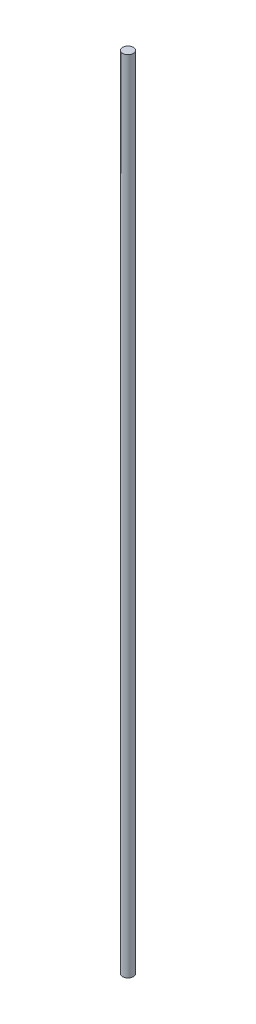
ISO-10303-21;
HEADER;
FILE_DESCRIPTION(('STEP AP214'),'2;1');
FILE_NAME('part.step','',(''),(''),'','','');
FILE_SCHEMA(('AUTOMOTIVE_DESIGN { 1 0 10303 214 1 1 1 1 }'));
ENDSEC;
DATA;
#1=APPLICATION_CONTEXT('core data for automotive mechanical design processes');
#2=APPLICATION_PROTOCOL_DEFINITION('international standard','automotive_design',2000,#1);
#3=PRODUCT_CONTEXT('',#1,'mechanical');
#4=PRODUCT('Part','Part','',(#3));
#5=PRODUCT_RELATED_PRODUCT_CATEGORY('part','',(#4));
#6=PRODUCT_DEFINITION_FORMATION('','',#4);
#7=PRODUCT_DEFINITION_CONTEXT('part definition',#1,'design');
#8=PRODUCT_DEFINITION('design','',#6,#7);
#9=PRODUCT_DEFINITION_SHAPE('','',#8);
#10=(LENGTH_UNIT() NAMED_UNIT(*) SI_UNIT(.MILLI.,.METRE.));
#11=(NAMED_UNIT(*) PLANE_ANGLE_UNIT() SI_UNIT($,.RADIAN.));
#12=(NAMED_UNIT(*) SI_UNIT($,.STERADIAN.) SOLID_ANGLE_UNIT());
#13=UNCERTAINTY_MEASURE_WITH_UNIT(LENGTH_MEASURE(1.E-05),#10,'distance_accuracy_value','');
#14=(GEOMETRIC_REPRESENTATION_CONTEXT(3) GLOBAL_UNCERTAINTY_ASSIGNED_CONTEXT((#13)) GLOBAL_UNIT_ASSIGNED_CONTEXT((#10,
#11,#12)) REPRESENTATION_CONTEXT('',''));
#15=CARTESIAN_POINT('',(0.,0.,0.));
#16=DIRECTION('',(0.,0.,1.));
#17=DIRECTION('',(1.,0.,0.));
#18=AXIS2_PLACEMENT_3D('',#15,#16,#17);
#19=CARTESIAN_POINT('',(0.,300.,0.));
#20=DIRECTION('',(0.,-1.,0.));
#21=DIRECTION('',(0.,0.,-1.));
#22=AXIS2_PLACEMENT_3D('',#19,#20,#21);
#23=CYLINDRICAL_SURFACE('',#22,2.);
#24=CARTESIAN_POINT('',(0.,300.,0.));
#25=DIRECTION('',(0.,1.,0.));
#26=DIRECTION('',(0.,0.,1.));
#27=AXIS2_PLACEMENT_3D('',#24,#25,#26);
#28=CIRCLE('',#27,2.);
#29=CARTESIAN_POINT('',(0.,300.,2.));
#30=VERTEX_POINT('',#29);
#31=EDGE_CURVE('E10',#30,#30,#28,.T.);
#32=ORIENTED_EDGE('',*,*,#31,.F.);
#33=EDGE_LOOP('',(#32));
#34=FACE_BOUND('',#33,.T.);
#35=CARTESIAN_POINT('',(0.,0.,0.));
#36=DIRECTION('',(0.,1.,0.));
#37=DIRECTION('',(0.,0.,1.));
#38=AXIS2_PLACEMENT_3D('',#35,#36,#37);
#39=CIRCLE('',#38,2.);
#40=CARTESIAN_POINT('',(0.,0.,2.));
#41=VERTEX_POINT('',#40);
#42=EDGE_CURVE('E40',#41,#41,#39,.T.);
#43=ORIENTED_EDGE('',*,*,#42,.T.);
#44=EDGE_LOOP('',(#43));
#45=FACE_BOUND('',#44,.T.);
#46=ADVANCED_FACE('F37',(#34,#45),#23,.T.);
#47=CARTESIAN_POINT('',(0.,300.,0.));
#48=DIRECTION('',(0.,1.,0.));
#49=DIRECTION('',(0.,0.,1.));
#50=AXIS2_PLACEMENT_3D('',#47,#48,#49);
#51=PLANE('',#50);
#52=ORIENTED_EDGE('',*,*,#31,.T.);
#53=EDGE_LOOP('',(#52));
#54=FACE_BOUND('',#53,.T.);
#55=ADVANCED_FACE('F52',(#54),#51,.T.);
#56=CARTESIAN_POINT('',(0.,0.,0.));
#57=DIRECTION('',(0.,1.,0.));
#58=DIRECTION('',(0.,0.,1.));
#59=AXIS2_PLACEMENT_3D('',#56,#57,#58);
#60=PLANE('',#59);
#61=ORIENTED_EDGE('',*,*,#42,.F.);
#62=EDGE_LOOP('',(#61));
#63=FACE_BOUND('',#62,.T.);
#64=ADVANCED_FACE('F50',(#63),#60,.F.);
#65=CLOSED_SHELL('',(#46,#55,#64));
#66=MANIFOLD_SOLID_BREP('B2',#65);
#67=ADVANCED_BREP_SHAPE_REPRESENTATION('',(#18,#66),#14);
#68=SHAPE_DEFINITION_REPRESENTATION(#9,#67);
ENDSEC;
END-ISO-10303-21;
